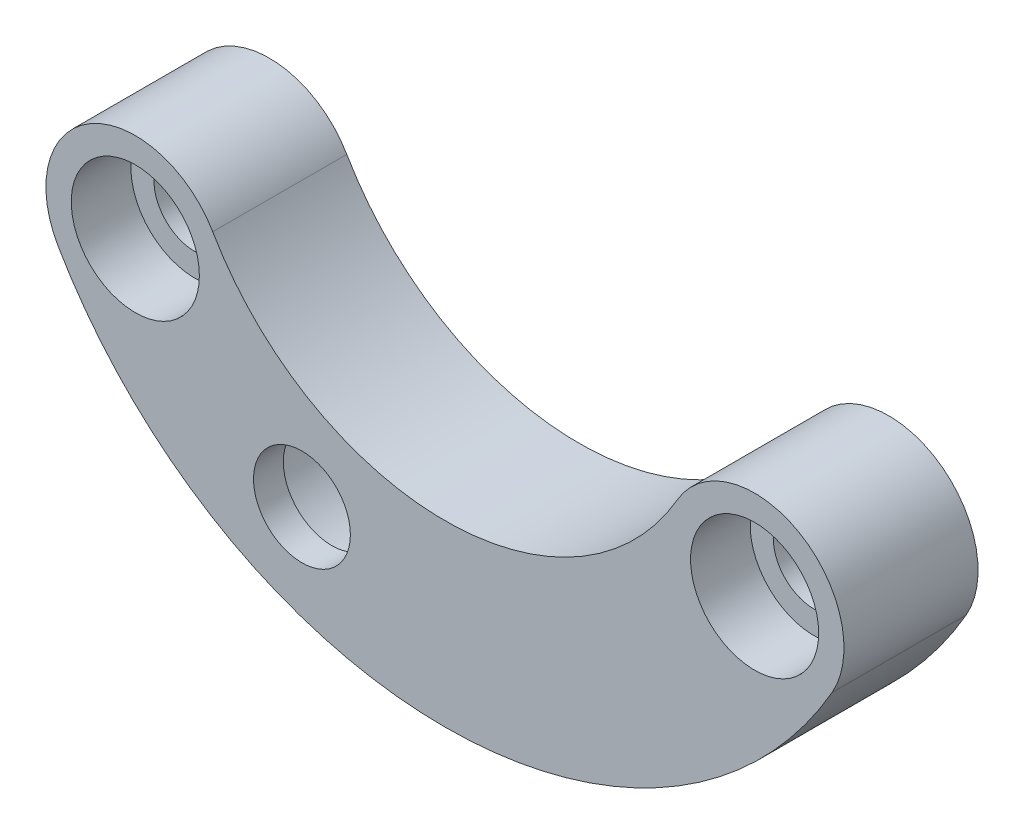
ISO-10303-21;
HEADER;
FILE_DESCRIPTION(('STEP AP214'),'2;1');
FILE_NAME('part.step','',(''),(''),'','','');
FILE_SCHEMA(('AUTOMOTIVE_DESIGN { 1 0 10303 214 1 1 1 1 }'));
ENDSEC;
DATA;
#1=APPLICATION_CONTEXT('core data for automotive mechanical design processes');
#2=APPLICATION_PROTOCOL_DEFINITION('international standard','automotive_design',2000,#1);
#3=PRODUCT_CONTEXT('',#1,'mechanical');
#4=PRODUCT('Part','Part','',(#3));
#5=PRODUCT_RELATED_PRODUCT_CATEGORY('part','',(#4));
#6=PRODUCT_DEFINITION_FORMATION('','',#4);
#7=PRODUCT_DEFINITION_CONTEXT('part definition',#1,'design');
#8=PRODUCT_DEFINITION('design','',#6,#7);
#9=PRODUCT_DEFINITION_SHAPE('','',#8);
#10=(LENGTH_UNIT() NAMED_UNIT(*) SI_UNIT(.MILLI.,.METRE.));
#11=(NAMED_UNIT(*) PLANE_ANGLE_UNIT() SI_UNIT($,.RADIAN.));
#12=(NAMED_UNIT(*) SI_UNIT($,.STERADIAN.) SOLID_ANGLE_UNIT());
#13=UNCERTAINTY_MEASURE_WITH_UNIT(LENGTH_MEASURE(1.E-05),#10,'distance_accuracy_value','');
#14=(GEOMETRIC_REPRESENTATION_CONTEXT(3) GLOBAL_UNCERTAINTY_ASSIGNED_CONTEXT((#13)) GLOBAL_UNIT_ASSIGNED_CONTEXT((#10,
#11,#12)) REPRESENTATION_CONTEXT('',''));
#15=CARTESIAN_POINT('',(0.,0.,0.));
#16=DIRECTION('',(0.,0.,1.));
#17=DIRECTION('',(1.,0.,0.));
#18=AXIS2_PLACEMENT_3D('',#15,#16,#17);
#19=CARTESIAN_POINT('',(-4.8,-10.998181667894,0.));
#20=DIRECTION('',(0.,0.,1.));
#21=DIRECTION('',(1.,0.,0.));
#22=AXIS2_PLACEMENT_3D('',#19,#20,#21);
#23=CYLINDRICAL_SURFACE('',#22,1.625);
#24=CARTESIAN_POINT('',(-4.8,-10.998181667894,4.5));
#25=DIRECTION('',(0.,0.,1.));
#26=DIRECTION('',(1.,0.,0.));
#27=AXIS2_PLACEMENT_3D('',#24,#25,#26);
#28=CIRCLE('',#27,1.625);
#29=CARTESIAN_POINT('',(-3.175,-10.998181667894,4.5));
#30=VERTEX_POINT('',#29);
#31=EDGE_CURVE('E137',#30,#30,#28,.T.);
#32=ORIENTED_EDGE('',*,*,#31,.T.);
#33=EDGE_LOOP('',(#32));
#34=FACE_BOUND('',#33,.T.);
#35=CARTESIAN_POINT('',(-4.8,-10.998181667894,3.5));
#36=DIRECTION('',(0.,0.,-1.));
#37=DIRECTION('',(-1.,0.,0.));
#38=AXIS2_PLACEMENT_3D('',#35,#36,#37);
#39=CIRCLE('',#38,1.625);
#40=CARTESIAN_POINT('',(-6.425,-10.998181667894,3.5));
#41=VERTEX_POINT('',#40);
#42=EDGE_CURVE('E47',#41,#41,#39,.F.);
#43=ORIENTED_EDGE('',*,*,#42,.F.);
#44=EDGE_LOOP('',(#43));
#45=FACE_BOUND('',#44,.T.);
#46=ADVANCED_FACE('F43',(#34,#45),#23,.F.);
#47=CARTESIAN_POINT('',(-10.3923048454132,-6.00000000000005,4.5));
#48=DIRECTION('',(0.,0.,-1.));
#49=DIRECTION('',(-1.,0.,0.));
#50=AXIS2_PLACEMENT_3D('',#47,#48,#49);
#51=CYLINDRICAL_SURFACE('',#50,1.375);
#52=CARTESIAN_POINT('',(-10.3923048454132,-6.00000000000005,0.));
#53=DIRECTION('',(0.,0.,1.));
#54=DIRECTION('',(1.,0.,0.));
#55=AXIS2_PLACEMENT_3D('',#52,#53,#54);
#56=CIRCLE('',#55,1.375);
#57=CARTESIAN_POINT('',(-9.01730484541324,-6.00000000000005,0.));
#58=VERTEX_POINT('',#57);
#59=EDGE_CURVE('E119',#58,#58,#56,.T.);
#60=ORIENTED_EDGE('',*,*,#59,.F.);
#61=EDGE_LOOP('',(#60));
#62=FACE_BOUND('',#61,.T.);
#63=CARTESIAN_POINT('',(-10.3923048454132,-6.00000000000005,2.5));
#64=DIRECTION('',(0.,0.,1.));
#65=DIRECTION('',(1.,0.,0.));
#66=AXIS2_PLACEMENT_3D('',#63,#64,#65);
#67=CIRCLE('',#66,1.375);
#68=CARTESIAN_POINT('',(-9.01730484541324,-6.00000000000005,2.5));
#69=VERTEX_POINT('',#68);
#70=EDGE_CURVE('E133',#69,#69,#67,.T.);
#71=ORIENTED_EDGE('',*,*,#70,.T.);
#72=EDGE_LOOP('',(#71));
#73=FACE_BOUND('',#72,.T.);
#74=ADVANCED_FACE('F161',(#62,#73),#51,.F.);
#75=CARTESIAN_POINT('',(10.3923048454132,-6.00000000000005,4.5));
#76=DIRECTION('',(0.,0.,-1.));
#77=DIRECTION('',(-1.,0.,0.));
#78=AXIS2_PLACEMENT_3D('',#75,#76,#77);
#79=CYLINDRICAL_SURFACE('',#78,1.375);
#80=CARTESIAN_POINT('',(10.3923048454132,-6.00000000000005,0.));
#81=DIRECTION('',(0.,0.,1.));
#82=DIRECTION('',(-1.,0.,0.));
#83=AXIS2_PLACEMENT_3D('',#80,#81,#82);
#84=CIRCLE('',#83,1.375);
#85=CARTESIAN_POINT('',(9.01730484541324,-6.00000000000005,0.));
#86=VERTEX_POINT('',#85);
#87=EDGE_CURVE('E142',#86,#86,#84,.T.);
#88=ORIENTED_EDGE('',*,*,#87,.F.);
#89=EDGE_LOOP('',(#88));
#90=FACE_BOUND('',#89,.T.);
#91=CARTESIAN_POINT('',(10.3923048454132,-6.00000000000005,2.5));
#92=DIRECTION('',(0.,0.,1.));
#93=DIRECTION('',(1.,0.,0.));
#94=AXIS2_PLACEMENT_3D('',#91,#92,#93);
#95=CIRCLE('',#94,1.375);
#96=CARTESIAN_POINT('',(11.7673048454132,-6.00000000000005,2.5));
#97=VERTEX_POINT('',#96);
#98=EDGE_CURVE('E130',#97,#97,#95,.T.);
#99=ORIENTED_EDGE('',*,*,#98,.T.);
#100=EDGE_LOOP('',(#99));
#101=FACE_BOUND('',#100,.T.);
#102=ADVANCED_FACE('F163',(#90,#101),#79,.F.);
#103=CARTESIAN_POINT('',(5.19615242270662,-3.00000000000003,4.5));
#104=DIRECTION('',(0.,0.,1.));
#105=DIRECTION('',(1.,0.,0.));
#106=AXIS2_PLACEMENT_3D('',#103,#104,#105);
#107=PLANE('',#106);
#108=CARTESIAN_POINT('',(-10.3923048454132,-6.00000000000005,4.5));
#109=DIRECTION('',(0.,0.,1.));
#110=DIRECTION('',(1.,0.,0.));
#111=AXIS2_PLACEMENT_3D('',#108,#109,#110);
#112=CIRCLE('',#111,2.15);
#113=CARTESIAN_POINT('',(-8.24230484541324,-6.00000000000005,4.5));
#114=VERTEX_POINT('',#113);
#115=EDGE_CURVE('E345',#114,#114,#112,.T.);
#116=ORIENTED_EDGE('',*,*,#115,.F.);
#117=EDGE_LOOP('',(#116));
#118=FACE_BOUND('',#117,.T.);
#119=CARTESIAN_POINT('',(10.3923048454132,-6.00000000000005,4.5));
#120=DIRECTION('',(0.,0.,1.));
#121=DIRECTION('',(1.,0.,0.));
#122=AXIS2_PLACEMENT_3D('',#119,#120,#121);
#123=CIRCLE('',#122,2.15);
#124=CARTESIAN_POINT('',(12.5423048454132,-6.00000000000005,4.5));
#125=VERTEX_POINT('',#124);
#126=EDGE_CURVE('E348',#125,#125,#123,.T.);
#127=ORIENTED_EDGE('',*,*,#126,.F.);
#128=EDGE_LOOP('',(#127));
#129=FACE_BOUND('',#128,.T.);
#130=ORIENTED_EDGE('',*,*,#31,.F.);
#131=EDGE_LOOP('',(#130));
#132=FACE_BOUND('',#131,.T.);
#133=CARTESIAN_POINT('',(0.,0.,4.5));
#134=DIRECTION('',(0.,0.,1.));
#135=DIRECTION('',(1.,0.,0.));
#136=AXIS2_PLACEMENT_3D('',#133,#134,#135);
#137=CIRCLE('',#136,15.);
#138=CARTESIAN_POINT('',(-12.9903810567665,-7.50000000000006,4.5));
#139=VERTEX_POINT('',#138);
#140=CARTESIAN_POINT('',(12.9903810567665,-7.50000000000006,4.5));
#141=VERTEX_POINT('',#140);
#142=EDGE_CURVE('E98',#139,#141,#137,.T.);
#143=ORIENTED_EDGE('',*,*,#142,.T.);
#144=CARTESIAN_POINT('',(10.3923048454132,-6.00000000000005,4.5));
#145=DIRECTION('',(0.,0.,1.));
#146=DIRECTION('',(-1.,0.,0.));
#147=AXIS2_PLACEMENT_3D('',#144,#145,#146);
#148=CIRCLE('',#147,3.);
#149=CARTESIAN_POINT('',(7.79422863405992,-4.50000000000005,4.5));
#150=VERTEX_POINT('',#149);
#151=EDGE_CURVE('E93',#141,#150,#148,.T.);
#152=ORIENTED_EDGE('',*,*,#151,.T.);
#153=CARTESIAN_POINT('',(0.,0.,4.5));
#154=DIRECTION('',(0.,0.,-1.));
#155=DIRECTION('',(1.,0.,0.));
#156=AXIS2_PLACEMENT_3D('',#153,#154,#155);
#157=CIRCLE('',#156,9.);
#158=CARTESIAN_POINT('',(-7.79422863405993,-4.50000000000004,4.5));
#159=VERTEX_POINT('',#158);
#160=EDGE_CURVE('E96',#150,#159,#157,.T.);
#161=ORIENTED_EDGE('',*,*,#160,.T.);
#162=CARTESIAN_POINT('',(-10.3923048454132,-6.00000000000005,4.5));
#163=DIRECTION('',(0.,0.,1.));
#164=DIRECTION('',(1.,0.,0.));
#165=AXIS2_PLACEMENT_3D('',#162,#163,#164);
#166=CIRCLE('',#165,3.);
#167=EDGE_CURVE('E63',#159,#139,#166,.T.);
#168=ORIENTED_EDGE('',*,*,#167,.T.);
#169=EDGE_LOOP('',(#143,#152,#161,#168));
#170=FACE_BOUND('',#169,.T.);
#171=ADVANCED_FACE('F94',(#118,#129,#132,#170),#107,.T.);
#172=CARTESIAN_POINT('',(5.19615242270662,-3.00000000000003,0.));
#173=DIRECTION('',(0.,0.,1.));
#174=DIRECTION('',(1.,0.,0.));
#175=AXIS2_PLACEMENT_3D('',#172,#173,#174);
#176=PLANE('',#175);
#177=CARTESIAN_POINT('',(-4.8,-10.998181667894,0.));
#178=DIRECTION('',(0.,0.,-1.));
#179=DIRECTION('',(-1.,0.,0.));
#180=AXIS2_PLACEMENT_3D('',#177,#178,#179);
#181=CIRCLE('',#180,2.9);
#182=CARTESIAN_POINT('',(-7.7,-10.998181667894,0.));
#183=VERTEX_POINT('',#182);
#184=EDGE_CURVE('E336',#183,#183,#181,.T.);
#185=ORIENTED_EDGE('',*,*,#184,.F.);
#186=EDGE_LOOP('',(#185));
#187=FACE_BOUND('',#186,.T.);
#188=CARTESIAN_POINT('',(0.,0.,0.));
#189=DIRECTION('',(0.,0.,1.));
#190=DIRECTION('',(1.,0.,0.));
#191=AXIS2_PLACEMENT_3D('',#188,#189,#190);
#192=CIRCLE('',#191,15.);
#193=CARTESIAN_POINT('',(-12.9903810567665,-7.50000000000006,0.));
#194=VERTEX_POINT('',#193);
#195=CARTESIAN_POINT('',(12.9903810567665,-7.50000000000006,0.));
#196=VERTEX_POINT('',#195);
#197=EDGE_CURVE('E115',#194,#196,#192,.T.);
#198=ORIENTED_EDGE('',*,*,#197,.F.);
#199=CARTESIAN_POINT('',(-10.3923048454132,-6.00000000000005,0.));
#200=DIRECTION('',(0.,0.,1.));
#201=DIRECTION('',(1.,0.,0.));
#202=AXIS2_PLACEMENT_3D('',#199,#200,#201);
#203=CIRCLE('',#202,3.);
#204=CARTESIAN_POINT('',(-7.79422863405993,-4.50000000000004,0.));
#205=VERTEX_POINT('',#204);
#206=EDGE_CURVE('E86',#205,#194,#203,.T.);
#207=ORIENTED_EDGE('',*,*,#206,.F.);
#208=CARTESIAN_POINT('',(0.,0.,0.));
#209=DIRECTION('',(0.,0.,-1.));
#210=DIRECTION('',(1.,0.,0.));
#211=AXIS2_PLACEMENT_3D('',#208,#209,#210);
#212=CIRCLE('',#211,9.);
#213=CARTESIAN_POINT('',(7.79422863405992,-4.50000000000005,0.));
#214=VERTEX_POINT('',#213);
#215=EDGE_CURVE('E80',#214,#205,#212,.T.);
#216=ORIENTED_EDGE('',*,*,#215,.F.);
#217=CARTESIAN_POINT('',(10.3923048454132,-6.00000000000005,0.));
#218=DIRECTION('',(0.,0.,1.));
#219=DIRECTION('',(-1.,0.,0.));
#220=AXIS2_PLACEMENT_3D('',#217,#218,#219);
#221=CIRCLE('',#220,3.);
#222=EDGE_CURVE('E103',#196,#214,#221,.T.);
#223=ORIENTED_EDGE('',*,*,#222,.F.);
#224=EDGE_LOOP('',(#198,#207,#216,#223));
#225=FACE_BOUND('',#224,.T.);
#226=ORIENTED_EDGE('',*,*,#59,.T.);
#227=EDGE_LOOP('',(#226));
#228=FACE_BOUND('',#227,.T.);
#229=ORIENTED_EDGE('',*,*,#87,.T.);
#230=EDGE_LOOP('',(#229));
#231=FACE_BOUND('',#230,.T.);
#232=ADVANCED_FACE('F158',(#187,#225,#228,#231),#176,.F.);
#233=CARTESIAN_POINT('',(0.,0.,4.5));
#234=DIRECTION('',(0.,0.,-1.));
#235=DIRECTION('',(-1.,0.,0.));
#236=AXIS2_PLACEMENT_3D('',#233,#234,#235);
#237=CYLINDRICAL_SURFACE('',#236,15.);
#238=ORIENTED_EDGE('',*,*,#197,.T.);
#239=DIRECTION('',(0.,0.,-1.));
#240=VECTOR('',#239,1.);
#241=CARTESIAN_POINT('',(12.9903810567665,-7.50000000000006,4.5));
#242=LINE('',#241,#240);
#243=EDGE_CURVE('E11',#141,#196,#242,.T.);
#244=ORIENTED_EDGE('',*,*,#243,.F.);
#245=ORIENTED_EDGE('',*,*,#142,.F.);
#246=DIRECTION('',(0.,0.,-1.));
#247=VECTOR('',#246,1.);
#248=CARTESIAN_POINT('',(-12.9903810567665,-7.50000000000006,4.5));
#249=LINE('',#248,#247);
#250=EDGE_CURVE('E111',#139,#194,#249,.T.);
#251=ORIENTED_EDGE('',*,*,#250,.T.);
#252=EDGE_LOOP('',(#238,#244,#245,#251));
#253=FACE_BOUND('',#252,.T.);
#254=ADVANCED_FACE('F45',(#253),#237,.T.);
#255=CARTESIAN_POINT('',(10.3923048454132,-6.00000000000005,4.5));
#256=DIRECTION('',(0.,0.,-1.));
#257=DIRECTION('',(-1.,0.,0.));
#258=AXIS2_PLACEMENT_3D('',#255,#256,#257);
#259=CYLINDRICAL_SURFACE('',#258,3.);
#260=ORIENTED_EDGE('',*,*,#222,.T.);
#261=DIRECTION('',(0.,0.,-1.));
#262=VECTOR('',#261,1.);
#263=CARTESIAN_POINT('',(7.79422863405992,-4.50000000000005,4.5));
#264=LINE('',#263,#262);
#265=EDGE_CURVE('E54',#150,#214,#264,.T.);
#266=ORIENTED_EDGE('',*,*,#265,.F.);
#267=ORIENTED_EDGE('',*,*,#151,.F.);
#268=ORIENTED_EDGE('',*,*,#243,.T.);
#269=EDGE_LOOP('',(#260,#266,#267,#268));
#270=FACE_BOUND('',#269,.T.);
#271=ADVANCED_FACE('F102',(#270),#259,.T.);
#272=CARTESIAN_POINT('',(0.,0.,4.5));
#273=DIRECTION('',(0.,0.,-1.));
#274=DIRECTION('',(-1.,0.,0.));
#275=AXIS2_PLACEMENT_3D('',#272,#273,#274);
#276=CYLINDRICAL_SURFACE('',#275,9.);
#277=ORIENTED_EDGE('',*,*,#215,.T.);
#278=DIRECTION('',(0.,0.,-1.));
#279=VECTOR('',#278,1.);
#280=CARTESIAN_POINT('',(-7.79422863405993,-4.50000000000004,4.5));
#281=LINE('',#280,#279);
#282=EDGE_CURVE('E105',#159,#205,#281,.T.);
#283=ORIENTED_EDGE('',*,*,#282,.F.);
#284=ORIENTED_EDGE('',*,*,#160,.F.);
#285=ORIENTED_EDGE('',*,*,#265,.T.);
#286=EDGE_LOOP('',(#277,#283,#284,#285));
#287=FACE_BOUND('',#286,.T.);
#288=ADVANCED_FACE('F107',(#287),#276,.F.);
#289=CARTESIAN_POINT('',(-10.3923048454132,-6.00000000000005,4.5));
#290=DIRECTION('',(0.,0.,-1.));
#291=DIRECTION('',(-1.,0.,0.));
#292=AXIS2_PLACEMENT_3D('',#289,#290,#291);
#293=CYLINDRICAL_SURFACE('',#292,3.);
#294=ORIENTED_EDGE('',*,*,#206,.T.);
#295=ORIENTED_EDGE('',*,*,#250,.F.);
#296=ORIENTED_EDGE('',*,*,#167,.F.);
#297=ORIENTED_EDGE('',*,*,#282,.T.);
#298=EDGE_LOOP('',(#294,#295,#296,#297));
#299=FACE_BOUND('',#298,.T.);
#300=ADVANCED_FACE('F179',(#299),#293,.T.);
#301=CARTESIAN_POINT('',(10.3923048454132,-6.00000000000005,2.5));
#302=DIRECTION('',(0.,0.,1.));
#303=DIRECTION('',(1.,0.,0.));
#304=AXIS2_PLACEMENT_3D('',#301,#302,#303);
#305=CYLINDRICAL_SURFACE('',#304,2.15);
#306=CARTESIAN_POINT('',(10.3923048454132,-6.00000000000005,2.5));
#307=DIRECTION('',(0.,0.,1.));
#308=DIRECTION('',(1.,0.,0.));
#309=AXIS2_PLACEMENT_3D('',#306,#307,#308);
#310=CIRCLE('',#309,2.15);
#311=CARTESIAN_POINT('',(12.5423048454132,-6.00000000000005,2.5));
#312=VERTEX_POINT('',#311);
#313=EDGE_CURVE('E150',#312,#312,#310,.T.);
#314=ORIENTED_EDGE('',*,*,#313,.F.);
#315=EDGE_LOOP('',(#314));
#316=FACE_BOUND('',#315,.T.);
#317=ORIENTED_EDGE('',*,*,#126,.T.);
#318=EDGE_LOOP('',(#317));
#319=FACE_BOUND('',#318,.T.);
#320=ADVANCED_FACE('F182',(#316,#319),#305,.F.);
#321=CARTESIAN_POINT('',(10.3923048454132,-6.00000000000005,2.5));
#322=DIRECTION('',(0.,0.,1.));
#323=DIRECTION('',(1.,0.,0.));
#324=AXIS2_PLACEMENT_3D('',#321,#322,#323);
#325=PLANE('',#324);
#326=ORIENTED_EDGE('',*,*,#98,.F.);
#327=EDGE_LOOP('',(#326));
#328=FACE_BOUND('',#327,.T.);
#329=ORIENTED_EDGE('',*,*,#313,.T.);
#330=EDGE_LOOP('',(#329));
#331=FACE_BOUND('',#330,.T.);
#332=ADVANCED_FACE('F254',(#328,#331),#325,.T.);
#333=CARTESIAN_POINT('',(-10.3923048454132,-6.00000000000005,2.5));
#334=DIRECTION('',(0.,0.,1.));
#335=DIRECTION('',(1.,0.,0.));
#336=AXIS2_PLACEMENT_3D('',#333,#334,#335);
#337=CYLINDRICAL_SURFACE('',#336,2.15);
#338=CARTESIAN_POINT('',(-10.3923048454132,-6.00000000000005,2.5));
#339=DIRECTION('',(0.,0.,1.));
#340=DIRECTION('',(1.,0.,0.));
#341=AXIS2_PLACEMENT_3D('',#338,#339,#340);
#342=CIRCLE('',#341,2.15);
#343=CARTESIAN_POINT('',(-8.24230484541324,-6.00000000000005,2.5));
#344=VERTEX_POINT('',#343);
#345=EDGE_CURVE('E134',#344,#344,#342,.T.);
#346=ORIENTED_EDGE('',*,*,#345,.F.);
#347=EDGE_LOOP('',(#346));
#348=FACE_BOUND('',#347,.T.);
#349=ORIENTED_EDGE('',*,*,#115,.T.);
#350=EDGE_LOOP('',(#349));
#351=FACE_BOUND('',#350,.T.);
#352=ADVANCED_FACE('F262',(#348,#351),#337,.F.);
#353=CARTESIAN_POINT('',(-10.3923048454132,-6.00000000000005,2.5));
#354=DIRECTION('',(0.,0.,1.));
#355=DIRECTION('',(1.,0.,0.));
#356=AXIS2_PLACEMENT_3D('',#353,#354,#355);
#357=PLANE('',#356);
#358=ORIENTED_EDGE('',*,*,#70,.F.);
#359=EDGE_LOOP('',(#358));
#360=FACE_BOUND('',#359,.T.);
#361=ORIENTED_EDGE('',*,*,#345,.T.);
#362=EDGE_LOOP('',(#361));
#363=FACE_BOUND('',#362,.T.);
#364=ADVANCED_FACE('F270',(#360,#363),#357,.T.);
#365=CARTESIAN_POINT('',(-4.8,-10.998181667894,3.5));
#366=DIRECTION('',(0.,0.,-1.));
#367=DIRECTION('',(-1.,0.,0.));
#368=AXIS2_PLACEMENT_3D('',#365,#366,#367);
#369=PLANE('',#368);
#370=CARTESIAN_POINT('',(-4.8,-10.998181667894,3.5));
#371=DIRECTION('',(0.,0.,-1.));
#372=DIRECTION('',(-1.,0.,0.));
#373=AXIS2_PLACEMENT_3D('',#370,#371,#372);
#374=CIRCLE('',#373,2.9);
#375=CARTESIAN_POINT('',(-7.7,-10.998181667894,3.5));
#376=VERTEX_POINT('',#375);
#377=EDGE_CURVE('E333',#376,#376,#374,.T.);
#378=ORIENTED_EDGE('',*,*,#377,.T.);
#379=EDGE_LOOP('',(#378));
#380=FACE_BOUND('',#379,.T.);
#381=ORIENTED_EDGE('',*,*,#42,.T.);
#382=EDGE_LOOP('',(#381));
#383=FACE_BOUND('',#382,.T.);
#384=ADVANCED_FACE('F278',(#380,#383),#369,.T.);
#385=CARTESIAN_POINT('',(-4.8,-10.998181667894,3.5));
#386=DIRECTION('',(0.,0.,-1.));
#387=DIRECTION('',(-1.,0.,0.));
#388=AXIS2_PLACEMENT_3D('',#385,#386,#387);
#389=CYLINDRICAL_SURFACE('',#388,2.9);
#390=ORIENTED_EDGE('',*,*,#377,.F.);
#391=EDGE_LOOP('',(#390));
#392=FACE_BOUND('',#391,.T.);
#393=ORIENTED_EDGE('',*,*,#184,.T.);
#394=EDGE_LOOP('',(#393));
#395=FACE_BOUND('',#394,.T.);
#396=ADVANCED_FACE('F285',(#392,#395),#389,.F.);
#397=CLOSED_SHELL('',(#46,#74,#102,#171,#232,#254,#271,#288,#300,#320,#332,#352,#364,#384,#396));
#398=MANIFOLD_SOLID_BREP('B2',#397);
#399=ADVANCED_BREP_SHAPE_REPRESENTATION('',(#18,#398),#14);
#400=SHAPE_DEFINITION_REPRESENTATION(#9,#399);
ENDSEC;
END-ISO-10303-21;
